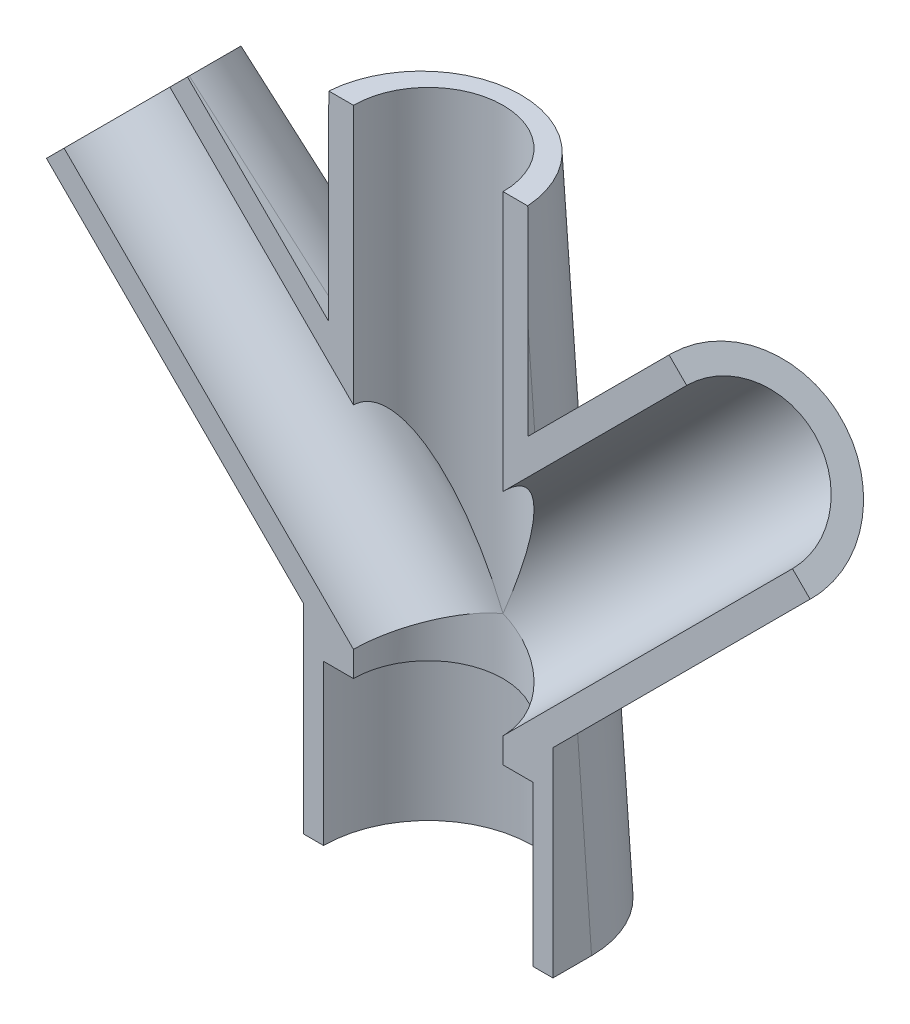
ISO-10303-21;
HEADER;
FILE_DESCRIPTION(('STEP AP214'),'2;1');
FILE_NAME('part.step','',(''),(''),'','','');
FILE_SCHEMA(('AUTOMOTIVE_DESIGN { 1 0 10303 214 1 1 1 1 }'));
ENDSEC;
DATA;
#1=APPLICATION_CONTEXT('core data for automotive mechanical design processes');
#2=APPLICATION_PROTOCOL_DEFINITION('international standard','automotive_design',2000,#1);
#3=PRODUCT_CONTEXT('',#1,'mechanical');
#4=PRODUCT('Part','Part','',(#3));
#5=PRODUCT_RELATED_PRODUCT_CATEGORY('part','',(#4));
#6=PRODUCT_DEFINITION_FORMATION('','',#4);
#7=PRODUCT_DEFINITION_CONTEXT('part definition',#1,'design');
#8=PRODUCT_DEFINITION('design','',#6,#7);
#9=PRODUCT_DEFINITION_SHAPE('','',#8);
#10=(LENGTH_UNIT() NAMED_UNIT(*) SI_UNIT(.MILLI.,.METRE.));
#11=(NAMED_UNIT(*) PLANE_ANGLE_UNIT() SI_UNIT($,.RADIAN.));
#12=(NAMED_UNIT(*) SI_UNIT($,.STERADIAN.) SOLID_ANGLE_UNIT());
#13=UNCERTAINTY_MEASURE_WITH_UNIT(LENGTH_MEASURE(1.E-05),#10,'distance_accuracy_value','');
#14=(GEOMETRIC_REPRESENTATION_CONTEXT(3) GLOBAL_UNCERTAINTY_ASSIGNED_CONTEXT((#13)) GLOBAL_UNIT_ASSIGNED_CONTEXT((#10,
#11,#12)) REPRESENTATION_CONTEXT('',''));
#15=CARTESIAN_POINT('',(0.,0.,0.));
#16=DIRECTION('',(0.,0.,1.));
#17=DIRECTION('',(1.,0.,0.));
#18=AXIS2_PLACEMENT_3D('',#15,#16,#17);
#19=CARTESIAN_POINT('',(0.,-10.,6.25));
#20=DIRECTION('',(0.,1.,0.));
#21=DIRECTION('',(0.,0.,1.));
#22=AXIS2_PLACEMENT_3D('',#19,#20,#21);
#23=CYLINDRICAL_SURFACE('',#22,3.75);
#24=CARTESIAN_POINT('',(0.,0.821067811865342,6.25));
#25=DIRECTION('',(-0.382683432365087,0.923879532511288,0.));
#26=DIRECTION('',(-0.923879532511288,-0.382683432365088,0.));
#27=AXIS2_PLACEMENT_3D('',#24,#25,#26);
#28=ELLIPSE('',#27,4.05897075109647,3.75);
#29=CARTESIAN_POINT('',(-3.75,-0.732233047033754,6.25));
#30=VERTEX_POINT('',#29);
#31=CARTESIAN_POINT('',(0.,0.821067811865341,2.5));
#32=VERTEX_POINT('',#31);
#33=EDGE_CURVE('E250',#30,#32,#28,.F.);
#34=ORIENTED_EDGE('',*,*,#33,.F.);
#35=DIRECTION('',(0.,1.,0.));
#36=VECTOR('',#35,1.);
#37=CARTESIAN_POINT('',(-3.75,-10.,6.25));
#38=LINE('',#37,#36);
#39=CARTESIAN_POINT('',(-3.75,-2.,6.25));
#40=VERTEX_POINT('',#39);
#41=EDGE_CURVE('E417',#30,#40,#38,.F.);
#42=ORIENTED_EDGE('',*,*,#41,.T.);
#43=CARTESIAN_POINT('',(0.,-2.,6.25));
#44=DIRECTION('',(0.,-1.,0.));
#45=DIRECTION('',(1.,0.,0.));
#46=AXIS2_PLACEMENT_3D('',#43,#44,#45);
#47=CIRCLE('',#46,3.75);
#48=CARTESIAN_POINT('',(3.75,-2.,6.25));
#49=VERTEX_POINT('',#48);
#50=EDGE_CURVE('E274',#49,#40,#47,.F.);
#51=ORIENTED_EDGE('',*,*,#50,.F.);
#52=DIRECTION('',(0.,1.,0.));
#53=VECTOR('',#52,1.);
#54=CARTESIAN_POINT('',(3.75,-10.,6.25));
#55=LINE('',#54,#53);
#56=CARTESIAN_POINT('',(3.75,-0.732233047033754,6.25));
#57=VERTEX_POINT('',#56);
#58=EDGE_CURVE('E430',#49,#57,#55,.T.);
#59=ORIENTED_EDGE('',*,*,#58,.T.);
#60=CARTESIAN_POINT('',(0.,0.821067811865342,6.25));
#61=DIRECTION('',(0.382683432365087,0.923879532511288,0.));
#62=DIRECTION('',(0.923879532511288,-0.382683432365088,0.));
#63=AXIS2_PLACEMENT_3D('',#60,#61,#62);
#64=ELLIPSE('',#63,4.05897075109647,3.75);
#65=EDGE_CURVE('E372',#57,#32,#64,.T.);
#66=ORIENTED_EDGE('',*,*,#65,.T.);
#67=EDGE_LOOP('',(#34,#42,#51,#59,#66));
#68=FACE_BOUND('',#67,.T.);
#69=ADVANCED_FACE('F37',(#68),#23,.F.);
#70=CARTESIAN_POINT('',(0.,22.892135623731,6.25));
#71=DIRECTION('',(0.,1.,0.));
#72=DIRECTION('',(0.,0.,1.));
#73=AXIS2_PLACEMENT_3D('',#70,#71,#72);
#74=CIRCLE('',#73,3.75);
#75=CARTESIAN_POINT('',(3.75,22.892135623731,6.25));
#76=VERTEX_POINT('',#75);
#77=CARTESIAN_POINT('',(-3.75,22.892135623731,6.25));
#78=VERTEX_POINT('',#77);
#79=EDGE_CURVE('E231',#76,#78,#74,.T.);
#80=ORIENTED_EDGE('',*,*,#79,.T.);
#81=DIRECTION('',(0.,1.,0.));
#82=VECTOR('',#81,1.);
#83=CARTESIAN_POINT('',(-3.75,-10.,6.25));
#84=LINE('',#83,#82);
#85=CARTESIAN_POINT('',(-3.75,9.87436867076451,6.25));
#86=VERTEX_POINT('',#85);
#87=EDGE_CURVE('E214',#78,#86,#84,.F.);
#88=ORIENTED_EDGE('',*,*,#87,.T.);
#89=CARTESIAN_POINT('',(0.,0.821067811865342,6.25));
#90=DIRECTION('',(-0.923879532511288,-0.382683432365088,0.));
#91=DIRECTION('',(-0.382683432365087,0.923879532511288,0.));
#92=AXIS2_PLACEMENT_3D('',#89,#90,#91);
#93=ELLIPSE('',#92,9.79922223657288,3.75);
#94=EDGE_CURVE('E375',#32,#86,#93,.F.);
#95=ORIENTED_EDGE('',*,*,#94,.F.);
#96=CARTESIAN_POINT('',(0.,0.821067811865342,6.25));
#97=DIRECTION('',(0.923879532511288,-0.382683432365088,0.));
#98=DIRECTION('',(0.382683432365087,0.923879532511288,0.));
#99=AXIS2_PLACEMENT_3D('',#96,#97,#98);
#100=ELLIPSE('',#99,9.79922223657288,3.75);
#101=CARTESIAN_POINT('',(3.75,9.87436867076451,6.25));
#102=VERTEX_POINT('',#101);
#103=EDGE_CURVE('E376',#32,#102,#100,.T.);
#104=ORIENTED_EDGE('',*,*,#103,.T.);
#105=DIRECTION('',(0.,1.,0.));
#106=VECTOR('',#105,1.);
#107=CARTESIAN_POINT('',(3.75,-10.,6.25));
#108=LINE('',#107,#106);
#109=EDGE_CURVE('E242',#102,#76,#108,.T.);
#110=ORIENTED_EDGE('',*,*,#109,.T.);
#111=EDGE_LOOP('',(#80,#88,#95,#104,#110));
#112=FACE_BOUND('',#111,.T.);
#113=ADVANCED_FACE('F240',(#112),#23,.F.);
#114=CARTESIAN_POINT('',(5.,12.892135623731,12.5));
#115=DIRECTION('',(-1.,0.,0.));
#116=DIRECTION('',(0.,-1.,0.));
#117=AXIS2_PLACEMENT_3D('',#114,#115,#116);
#118=PLANE('',#117);
#119=DIRECTION('',(0.,0.997564050259824,0.0697564737441255));
#120=VECTOR('',#119,1.);
#121=CARTESIAN_POINT('',(5.,22.5433532550103,6.5885943140451));
#122=LINE('',#121,#120);
#123=CARTESIAN_POINT('',(5.,12.892135623731,5.91371543371673));
#124=VERTEX_POINT('',#123);
#125=CARTESIAN_POINT('',(5.,17.7012289734311,6.25));
#126=VERTEX_POINT('',#125);
#127=EDGE_CURVE('E293',#124,#126,#122,.T.);
#128=ORIENTED_EDGE('',*,*,#127,.T.);
#129=DIRECTION('',(0.,-1.,0.));
#130=VECTOR('',#129,1.);
#131=CARTESIAN_POINT('',(5.,12.892135623731,6.25));
#132=LINE('',#131,#130);
#133=CARTESIAN_POINT('',(5.,12.892135623731,6.25));
#134=VERTEX_POINT('',#133);
#135=EDGE_CURVE('E236',#126,#134,#132,.T.);
#136=ORIENTED_EDGE('',*,*,#135,.T.);
#137=DIRECTION('',(0.,0.,-1.));
#138=VECTOR('',#137,1.);
#139=CARTESIAN_POINT('',(5.,12.892135623731,12.5));
#140=LINE('',#139,#138);
#141=EDGE_CURVE('E247',#134,#124,#140,.T.);
#142=ORIENTED_EDGE('',*,*,#141,.T.);
#143=EDGE_LOOP('',(#128,#136,#142));
#144=FACE_BOUND('',#143,.T.);
#145=ADVANCED_FACE('F518',(#144),#118,.F.);
#146=CARTESIAN_POINT('',(-5.00000000000003,22.892135623731,12.5));
#147=DIRECTION('',(0.,-1.,0.));
#148=DIRECTION('',(0.,0.,-1.));
#149=AXIS2_PLACEMENT_3D('',#146,#147,#148);
#150=PLANE('',#149);
#151=CARTESIAN_POINT('',(0.,22.892135623731,6.61298355315184));
#152=DIRECTION('',(0.,-1.,0.));
#153=DIRECTION('',(0.,0.,1.));
#154=AXIS2_PLACEMENT_3D('',#151,#152,#153);
#155=ELLIPSE('',#154,5.01220949040586,5.);
#156=CARTESIAN_POINT('',(0.,22.892135623731,1.60077406274597));
#157=VERTEX_POINT('',#156);
#158=CARTESIAN_POINT('',(-4.98687116992872,22.892135623731,6.25));
#159=VERTEX_POINT('',#158);
#160=EDGE_CURVE('E234',#157,#159,#155,.F.);
#161=ORIENTED_EDGE('',*,*,#160,.T.);
#162=DIRECTION('',(1.,0.,0.));
#163=VECTOR('',#162,1.);
#164=CARTESIAN_POINT('',(-24.7445923303939,22.892135623731,6.25));
#165=LINE('',#164,#163);
#166=EDGE_CURVE('E217',#159,#78,#165,.T.);
#167=ORIENTED_EDGE('',*,*,#166,.T.);
#168=ORIENTED_EDGE('',*,*,#79,.F.);
#169=CARTESIAN_POINT('',(4.98687116992869,22.892135623731,6.25));
#170=VERTEX_POINT('',#169);
#171=EDGE_CURVE('E237',#76,#170,#165,.T.);
#172=ORIENTED_EDGE('',*,*,#171,.T.);
#173=CARTESIAN_POINT('',(0.,22.892135623731,6.61298355315184));
#174=DIRECTION('',(0.,-1.,0.));
#175=DIRECTION('',(0.,0.,-1.));
#176=AXIS2_PLACEMENT_3D('',#173,#174,#175);
#177=ELLIPSE('',#176,5.01220949040586,5.);
#178=EDGE_CURVE('E297',#170,#157,#177,.F.);
#179=ORIENTED_EDGE('',*,*,#178,.T.);
#180=EDGE_LOOP('',(#161,#167,#168,#172,#179));
#181=FACE_BOUND('',#180,.T.);
#182=ADVANCED_FACE('F229',(#181),#150,.F.);
#183=CARTESIAN_POINT('',(-5.00000000000003,12.892135623731,12.5));
#184=DIRECTION('',(1.,0.,0.));
#185=DIRECTION('',(0.,1.,0.));
#186=AXIS2_PLACEMENT_3D('',#183,#184,#185);
#187=PLANE('',#186);
#188=DIRECTION('',(0.,0.,-1.));
#189=VECTOR('',#188,1.);
#190=CARTESIAN_POINT('',(-5.00000000000003,12.892135623731,12.5));
#191=LINE('',#190,#189);
#192=CARTESIAN_POINT('',(-5.00000000000003,12.892135623731,6.25));
#193=VERTEX_POINT('',#192);
#194=CARTESIAN_POINT('',(-5.00000000000003,12.892135623731,5.91371543371673));
#195=VERTEX_POINT('',#194);
#196=EDGE_CURVE('E271',#193,#195,#191,.T.);
#197=ORIENTED_EDGE('',*,*,#196,.F.);
#198=DIRECTION('',(0.,1.,0.));
#199=VECTOR('',#198,1.);
#200=CARTESIAN_POINT('',(-5.00000000000003,12.892135623731,6.25));
#201=LINE('',#200,#199);
#202=CARTESIAN_POINT('',(-5.00000000000003,17.7012289734311,6.25));
#203=VERTEX_POINT('',#202);
#204=EDGE_CURVE('E397',#193,#203,#201,.T.);
#205=ORIENTED_EDGE('',*,*,#204,.T.);
#206=DIRECTION('',(0.,-0.997564050259824,-0.0697564737441255));
#207=VECTOR('',#206,1.);
#208=CARTESIAN_POINT('',(-5.00000000000003,12.5433532550103,5.88932619460999));
#209=LINE('',#208,#207);
#210=EDGE_CURVE('E299',#203,#195,#209,.T.);
#211=ORIENTED_EDGE('',*,*,#210,.T.);
#212=EDGE_LOOP('',(#197,#205,#211));
#213=FACE_BOUND('',#212,.T.);
#214=ADVANCED_FACE('F489',(#213),#187,.F.);
#215=CARTESIAN_POINT('',(-12.0710678118655,19.9632034355965,12.5));
#216=DIRECTION('',(-0.707106781186551,-0.707106781186544,0.));
#217=DIRECTION('',(0.707106781186544,-0.707106781186551,0.));
#218=AXIS2_PLACEMENT_3D('',#215,#216,#217);
#219=PLANE('',#218);
#220=DIRECTION('',(0.,0.,-1.));
#221=VECTOR('',#220,1.);
#222=CARTESIAN_POINT('',(-12.0710678118655,19.9632034355965,12.5));
#223=LINE('',#222,#221);
#224=CARTESIAN_POINT('',(-12.0710678118655,19.9632034355965,6.25));
#225=VERTEX_POINT('',#224);
#226=CARTESIAN_POINT('',(-12.0710678118655,19.9632034355965,6.1609440482768));
#227=VERTEX_POINT('',#226);
#228=EDGE_CURVE('E269',#225,#227,#223,.T.);
#229=ORIENTED_EDGE('',*,*,#228,.F.);
#230=DIRECTION('',(0.707106781186544,-0.707106781186551,0.));
#231=VECTOR('',#230,1.);
#232=CARTESIAN_POINT('',(-12.0710678118655,19.9632034355965,6.25));
#233=LINE('',#232,#231);
#234=EDGE_CURVE('E406',#225,#193,#233,.T.);
#235=ORIENTED_EDGE('',*,*,#234,.T.);
#236=ORIENTED_EDGE('',*,*,#196,.T.);
#237=CARTESIAN_POINT('',(0.,7.8921356237309,5.56408137399917));
#238=DIRECTION('',(-0.707106781186551,-0.707106781186544,0.));
#239=DIRECTION('',(-0.703674354609934,0.703674354609941,0.0984114085285601));
#240=AXIS2_PLACEMENT_3D('',#237,#238,#239);
#241=ELLIPSE('',#240,7.08833463878715,5.);
#242=CARTESIAN_POINT('',(-4.99391383882773,12.8860494625587,5.66606123330891));
#243=VERTEX_POINT('',#242);
#244=EDGE_CURVE('E329',#195,#243,#241,.T.);
#245=ORIENTED_EDGE('',*,*,#244,.T.);
#246=DIRECTION('',(-0.706243967529306,0.706243967529313,0.049385389103661));
#247=VECTOR('',#246,1.);
#248=CARTESIAN_POINT('',(-11.9048741744751,19.7970097982061,6.14932265704879));
#249=LINE('',#248,#247);
#250=EDGE_CURVE('E302',#243,#227,#249,.T.);
#251=ORIENTED_EDGE('',*,*,#250,.T.);
#252=EDGE_LOOP('',(#229,#235,#236,#245,#251));
#253=FACE_BOUND('',#252,.T.);
#254=ADVANCED_FACE('F492',(#253),#219,.F.);
#255=CARTESIAN_POINT('',(-19.142135623731,12.892135623731,12.5));
#256=DIRECTION('',(0.707106781186544,-0.707106781186551,0.));
#257=DIRECTION('',(0.707106781186551,0.707106781186544,0.));
#258=AXIS2_PLACEMENT_3D('',#255,#256,#257);
#259=PLANE('',#258);
#260=DIRECTION('',(0.,0.,-1.));
#261=VECTOR('',#260,1.);
#262=CARTESIAN_POINT('',(-19.142135623731,12.892135623731,12.5));
#263=LINE('',#262,#261);
#264=CARTESIAN_POINT('',(-19.142135623731,12.892135623731,6.25));
#265=VERTEX_POINT('',#264);
#266=CARTESIAN_POINT('',(-19.142135623731,12.892135623731,6.16094404827679));
#267=VERTEX_POINT('',#266);
#268=EDGE_CURVE('E267',#265,#267,#263,.T.);
#269=ORIENTED_EDGE('',*,*,#268,.F.);
#270=DIRECTION('',(0.707106781186551,0.707106781186544,0.));
#271=VECTOR('',#270,1.);
#272=CARTESIAN_POINT('',(-19.142135623731,12.892135623731,6.25));
#273=LINE('',#272,#271);
#274=CARTESIAN_POINT('',(-18.2582521472478,13.7760191002142,6.25));
#275=VERTEX_POINT('',#274);
#276=EDGE_CURVE('E412',#265,#275,#273,.T.);
#277=ORIENTED_EDGE('',*,*,#276,.T.);
#278=CARTESIAN_POINT('',(-15.6066017177982,16.4276695296637,6.25));
#279=DIRECTION('',(-0.707106781186544,0.707106781186551,0.));
#280=DIRECTION('',(-0.707106781186551,-0.707106781186544,0.));
#281=AXIS2_PLACEMENT_3D('',#278,#279,#280);
#282=CIRCLE('',#281,3.75);
#283=CARTESIAN_POINT('',(-12.9549512883487,19.0793199591133,6.25));
#284=VERTEX_POINT('',#283);
#285=EDGE_CURVE('E244',#284,#275,#282,.T.);
#286=ORIENTED_EDGE('',*,*,#285,.F.);
#287=EDGE_CURVE('E409',#284,#225,#273,.T.);
#288=ORIENTED_EDGE('',*,*,#287,.T.);
#289=ORIENTED_EDGE('',*,*,#228,.T.);
#290=CARTESIAN_POINT('',(-15.6066017177982,16.4276695296637,6.1609440482768));
#291=DIRECTION('',(0.707106781186544,-0.707106781186551,0.));
#292=DIRECTION('',(0.,0.,-1.));
#293=AXIS2_PLACEMENT_3D('',#290,#291,#292);
#294=ELLIPSE('',#293,5.00610846744827,5.);
#295=CARTESIAN_POINT('',(-15.4322105334379,16.602060714024,1.1609291774243));
#296=VERTEX_POINT('',#295);
#297=EDGE_CURVE('E308',#227,#296,#294,.F.);
#298=ORIENTED_EDGE('',*,*,#297,.T.);
#299=CARTESIAN_POINT('',(-15.6066017177982,16.4276695296637,6.16094404827679));
#300=DIRECTION('',(0.707106781186544,-0.707106781186551,0.));
#301=DIRECTION('',(0.,0.,1.));
#302=AXIS2_PLACEMENT_3D('',#299,#300,#301);
#303=ELLIPSE('',#302,5.00610846744827,5.);
#304=EDGE_CURVE('E305',#296,#267,#303,.F.);
#305=ORIENTED_EDGE('',*,*,#304,.T.);
#306=EDGE_LOOP('',(#269,#277,#286,#288,#289,#298,#305));
#307=FACE_BOUND('',#306,.T.);
#308=ADVANCED_FACE('F495',(#307),#259,.F.);
#309=CARTESIAN_POINT('',(-6.24999999999999,0.,12.5));
#310=DIRECTION('',(0.707106781186548,0.707106781186548,0.));
#311=DIRECTION('',(-0.707106781186548,0.707106781186548,0.));
#312=AXIS2_PLACEMENT_3D('',#309,#310,#311);
#313=PLANE('',#312);
#314=DIRECTION('',(0.,0.,-1.));
#315=VECTOR('',#314,1.);
#316=CARTESIAN_POINT('',(-6.24999999999999,0.,12.5));
#317=LINE('',#316,#315);
#318=CARTESIAN_POINT('',(-6.24999999999999,0.,6.25));
#319=VERTEX_POINT('',#318);
#320=CARTESIAN_POINT('',(-6.24999999999999,0.,5.25943810496592));
#321=VERTEX_POINT('',#320);
#322=EDGE_CURVE('E265',#319,#321,#317,.T.);
#323=ORIENTED_EDGE('',*,*,#322,.F.);
#324=DIRECTION('',(-0.707106781186548,0.707106781186548,0.));
#325=VECTOR('',#324,1.);
#326=CARTESIAN_POINT('',(-6.24999999999999,0.,6.25));
#327=LINE('',#326,#325);
#328=EDGE_CURVE('E422',#319,#265,#327,.T.);
#329=ORIENTED_EDGE('',*,*,#328,.T.);
#330=ORIENTED_EDGE('',*,*,#268,.T.);
#331=DIRECTION('',(0.706243967529309,-0.706243967529309,-0.0493853891036608));
#332=VECTOR('',#331,1.);
#333=CARTESIAN_POINT('',(-6.06656061754104,-0.183439382458955,5.24661077376568));
#334=LINE('',#333,#332);
#335=EDGE_CURVE('E310',#267,#321,#334,.T.);
#336=ORIENTED_EDGE('',*,*,#335,.T.);
#337=EDGE_LOOP('',(#323,#329,#330,#336));
#338=FACE_BOUND('',#337,.T.);
#339=ADVANCED_FACE('F546',(#338),#313,.F.);
#340=CARTESIAN_POINT('',(-6.24999999999999,0.,12.5));
#341=DIRECTION('',(1.,0.,0.));
#342=DIRECTION('',(0.,1.,0.));
#343=AXIS2_PLACEMENT_3D('',#340,#341,#342);
#344=PLANE('',#343);
#345=DIRECTION('',(0.,0.,-1.));
#346=VECTOR('',#345,1.);
#347=CARTESIAN_POINT('',(-6.24999999999999,-10.,12.5));
#348=LINE('',#347,#346);
#349=CARTESIAN_POINT('',(-6.24999999999999,-10.,6.25));
#350=VERTEX_POINT('',#349);
#351=CARTESIAN_POINT('',(-6.24999999999999,-10.,4.31294137097075));
#352=VERTEX_POINT('',#351);
#353=EDGE_CURVE('E263',#350,#352,#348,.T.);
#354=ORIENTED_EDGE('',*,*,#353,.F.);
#355=DIRECTION('',(0.,1.,0.));
#356=VECTOR('',#355,1.);
#357=CARTESIAN_POINT('',(-6.24999999999999,0.,6.25));
#358=LINE('',#357,#356);
#359=EDGE_CURVE('E425',#350,#319,#358,.T.);
#360=ORIENTED_EDGE('',*,*,#359,.T.);
#361=ORIENTED_EDGE('',*,*,#322,.T.);
#362=CARTESIAN_POINT('',(-6.25,7.07106781186548,5.50666671952599));
#363=DIRECTION('',(1.,0.,0.));
#364=DIRECTION('',(0.,0.997564050259824,0.0697564737441254));
#365=AXIS2_PLACEMENT_3D('',#362,#363,#364);
#366=ELLIPSE('',#365,7.07970648937614,5.);
#367=CARTESIAN_POINT('',(-6.24999999999999,0.008607131672656,5.01281135968371));
#368=VERTEX_POINT('',#367);
#369=EDGE_CURVE('E46',#321,#368,#366,.T.);
#370=ORIENTED_EDGE('',*,*,#369,.T.);
#371=DIRECTION('',(0.,-0.997564050259824,-0.0697564737441254));
#372=VECTOR('',#371,1.);
#373=CARTESIAN_POINT('',(-6.24999999999999,-10.3487823687206,4.28855213186402));
#374=LINE('',#373,#372);
#375=EDGE_CURVE('E313',#368,#352,#374,.T.);
#376=ORIENTED_EDGE('',*,*,#375,.T.);
#377=EDGE_LOOP('',(#354,#360,#361,#370,#376));
#378=FACE_BOUND('',#377,.T.);
#379=ADVANCED_FACE('F506',(#378),#344,.F.);
#380=CARTESIAN_POINT('',(-6.24999999999999,-10.,12.5));
#381=DIRECTION('',(0.,1.,0.));
#382=DIRECTION('',(-1.,0.,0.));
#383=AXIS2_PLACEMENT_3D('',#380,#381,#382);
#384=PLANE('',#383);
#385=DIRECTION('',(0.,0.,-1.));
#386=VECTOR('',#385,1.);
#387=CARTESIAN_POINT('',(6.25,-10.,12.5));
#388=LINE('',#387,#386);
#389=CARTESIAN_POINT('',(6.25,-10.,6.25));
#390=VERTEX_POINT('',#389);
#391=CARTESIAN_POINT('',(6.25,-10.,4.31294137097076));
#392=VERTEX_POINT('',#391);
#393=EDGE_CURVE('E261',#390,#392,#388,.T.);
#394=ORIENTED_EDGE('',*,*,#393,.F.);
#395=DIRECTION('',(1.,0.,0.));
#396=VECTOR('',#395,1.);
#397=CARTESIAN_POINT('',(-24.7445923303939,-10.,6.25));
#398=LINE('',#397,#396);
#399=CARTESIAN_POINT('',(5.25,-10.,6.25));
#400=VERTEX_POINT('',#399);
#401=EDGE_CURVE('E445',#400,#390,#398,.T.);
#402=ORIENTED_EDGE('',*,*,#401,.F.);
#403=CARTESIAN_POINT('',(0.,-10.,6.25));
#404=DIRECTION('',(0.,-1.,0.));
#405=DIRECTION('',(1.,0.,0.));
#406=AXIS2_PLACEMENT_3D('',#403,#404,#405);
#407=CIRCLE('',#406,5.25);
#408=CARTESIAN_POINT('',(-5.25,-10.,6.25));
#409=VERTEX_POINT('',#408);
#410=EDGE_CURVE('E360',#409,#400,#407,.T.);
#411=ORIENTED_EDGE('',*,*,#410,.F.);
#412=EDGE_CURVE('E54',#350,#409,#398,.T.);
#413=ORIENTED_EDGE('',*,*,#412,.F.);
#414=ORIENTED_EDGE('',*,*,#353,.T.);
#415=CARTESIAN_POINT('',(-1.24999999999999,-10.,4.31294137097076));
#416=DIRECTION('',(0.,1.,0.));
#417=DIRECTION('',(0.,0.,1.));
#418=AXIS2_PLACEMENT_3D('',#415,#416,#417);
#419=ELLIPSE('',#418,5.01220949040586,5.);
#420=CARTESIAN_POINT('',(-1.24999999999999,-10.,-0.699268119435106));
#421=VERTEX_POINT('',#420);
#422=EDGE_CURVE('E319',#352,#421,#419,.F.);
#423=ORIENTED_EDGE('',*,*,#422,.T.);
#424=DIRECTION('',(1.,0.,0.));
#425=VECTOR('',#424,1.);
#426=CARTESIAN_POINT('',(0.,-10.,-0.699268119435106));
#427=LINE('',#426,#425);
#428=CARTESIAN_POINT('',(1.25,-10.,-0.699268119435106));
#429=VERTEX_POINT('',#428);
#430=EDGE_CURVE('E243',#421,#429,#427,.T.);
#431=ORIENTED_EDGE('',*,*,#430,.T.);
#432=CARTESIAN_POINT('',(1.25,-10.,4.31294137097076));
#433=DIRECTION('',(0.,1.,0.));
#434=DIRECTION('',(0.,0.,-1.));
#435=AXIS2_PLACEMENT_3D('',#432,#433,#434);
#436=ELLIPSE('',#435,5.01220949040586,5.);
#437=EDGE_CURVE('E316',#429,#392,#436,.F.);
#438=ORIENTED_EDGE('',*,*,#437,.T.);
#439=EDGE_LOOP('',(#394,#402,#411,#413,#414,#423,#431,#438));
#440=FACE_BOUND('',#439,.T.);
#441=ADVANCED_FACE('F444',(#440),#384,.F.);
#442=CARTESIAN_POINT('',(6.24999999999999,0.,12.5));
#443=DIRECTION('',(-1.,0.,0.));
#444=DIRECTION('',(0.,-1.,0.));
#445=AXIS2_PLACEMENT_3D('',#442,#443,#444);
#446=PLANE('',#445);
#447=DIRECTION('',(0.,0.,-1.));
#448=VECTOR('',#447,1.);
#449=CARTESIAN_POINT('',(6.24999999999999,0.,12.5));
#450=LINE('',#449,#448);
#451=CARTESIAN_POINT('',(6.24999999999999,0.,6.25));
#452=VERTEX_POINT('',#451);
#453=CARTESIAN_POINT('',(6.24999999999999,0.,5.25943810496593));
#454=VERTEX_POINT('',#453);
#455=EDGE_CURVE('E259',#452,#454,#450,.T.);
#456=ORIENTED_EDGE('',*,*,#455,.F.);
#457=DIRECTION('',(0.,-1.,0.));
#458=VECTOR('',#457,1.);
#459=CARTESIAN_POINT('',(6.24999999999999,0.,6.25));
#460=LINE('',#459,#458);
#461=EDGE_CURVE('E338',#452,#390,#460,.T.);
#462=ORIENTED_EDGE('',*,*,#461,.T.);
#463=ORIENTED_EDGE('',*,*,#393,.T.);
#464=DIRECTION('',(0.,0.997564050259824,0.0697564737441254));
#465=VECTOR('',#464,1.);
#466=CARTESIAN_POINT('',(6.24999999999999,-0.348782368720626,4.98782025129912));
#467=LINE('',#466,#465);
#468=CARTESIAN_POINT('',(6.24999999999999,0.00860713167265768,5.01281135968371));
#469=VERTEX_POINT('',#468);
#470=EDGE_CURVE('E321',#392,#469,#467,.T.);
#471=ORIENTED_EDGE('',*,*,#470,.T.);
#472=CARTESIAN_POINT('',(6.24999999999999,7.07106781186547,5.50666671952599));
#473=DIRECTION('',(-1.,0.,0.));
#474=DIRECTION('',(0.,-0.997564050259824,-0.0697564737441255));
#475=AXIS2_PLACEMENT_3D('',#472,#473,#474);
#476=ELLIPSE('',#475,7.07970648937613,5.);
#477=EDGE_CURVE('E11',#469,#454,#476,.T.);
#478=ORIENTED_EDGE('',*,*,#477,.T.);
#479=EDGE_LOOP('',(#456,#462,#463,#471,#478));
#480=FACE_BOUND('',#479,.T.);
#481=ADVANCED_FACE('F441',(#480),#446,.F.);
#482=CARTESIAN_POINT('',(6.24999999999999,0.,12.5));
#483=DIRECTION('',(-0.707106781186547,0.707106781186548,0.));
#484=DIRECTION('',(-0.707106781186548,-0.707106781186547,0.));
#485=AXIS2_PLACEMENT_3D('',#482,#483,#484);
#486=PLANE('',#485);
#487=DIRECTION('',(0.,0.,-1.));
#488=VECTOR('',#487,1.);
#489=CARTESIAN_POINT('',(19.142135623731,12.892135623731,12.5));
#490=LINE('',#489,#488);
#491=CARTESIAN_POINT('',(19.142135623731,12.892135623731,6.25));
#492=VERTEX_POINT('',#491);
#493=CARTESIAN_POINT('',(19.142135623731,12.892135623731,6.1609440482768));
#494=VERTEX_POINT('',#493);
#495=EDGE_CURVE('E257',#492,#494,#490,.T.);
#496=ORIENTED_EDGE('',*,*,#495,.F.);
#497=DIRECTION('',(-0.707106781186548,-0.707106781186547,0.));
#498=VECTOR('',#497,1.);
#499=CARTESIAN_POINT('',(6.24999999999999,0.,6.25));
#500=LINE('',#499,#498);
#501=EDGE_CURVE('E435',#492,#452,#500,.T.);
#502=ORIENTED_EDGE('',*,*,#501,.T.);
#503=ORIENTED_EDGE('',*,*,#455,.T.);
#504=DIRECTION('',(0.706243967529309,0.706243967529309,0.0493853891036608));
#505=VECTOR('',#504,1.);
#506=CARTESIAN_POINT('',(18.958696241272,12.708696241272,6.14811671707655));
#507=LINE('',#506,#505);
#508=EDGE_CURVE('E323',#454,#494,#507,.T.);
#509=ORIENTED_EDGE('',*,*,#508,.T.);
#510=EDGE_LOOP('',(#496,#502,#503,#509));
#511=FACE_BOUND('',#510,.T.);
#512=ADVANCED_FACE('F461',(#511),#486,.F.);
#513=CARTESIAN_POINT('',(19.142135623731,12.892135623731,12.5));
#514=DIRECTION('',(-0.707106781186544,-0.707106781186551,0.));
#515=DIRECTION('',(0.707106781186551,-0.707106781186544,0.));
#516=AXIS2_PLACEMENT_3D('',#513,#514,#515);
#517=PLANE('',#516);
#518=DIRECTION('',(0.,0.,-1.));
#519=VECTOR('',#518,1.);
#520=CARTESIAN_POINT('',(12.0710678118655,19.9632034355965,12.5));
#521=LINE('',#520,#519);
#522=CARTESIAN_POINT('',(12.0710678118655,19.9632034355965,6.25));
#523=VERTEX_POINT('',#522);
#524=CARTESIAN_POINT('',(12.0710678118655,19.9632034355965,6.1609440482768));
#525=VERTEX_POINT('',#524);
#526=EDGE_CURVE('E255',#523,#525,#521,.T.);
#527=ORIENTED_EDGE('',*,*,#526,.F.);
#528=DIRECTION('',(0.707106781186551,-0.707106781186544,0.));
#529=VECTOR('',#528,1.);
#530=CARTESIAN_POINT('',(19.142135623731,12.892135623731,6.25));
#531=LINE('',#530,#529);
#532=CARTESIAN_POINT('',(12.9549512883487,19.0793199591133,6.25));
#533=VERTEX_POINT('',#532);
#534=EDGE_CURVE('E395',#523,#533,#531,.T.);
#535=ORIENTED_EDGE('',*,*,#534,.T.);
#536=CARTESIAN_POINT('',(15.6066017177982,16.4276695296637,6.25));
#537=DIRECTION('',(-0.707106781186544,-0.707106781186551,0.));
#538=DIRECTION('',(0.707106781186551,-0.707106781186544,0.));
#539=AXIS2_PLACEMENT_3D('',#536,#537,#538);
#540=CIRCLE('',#539,3.75);
#541=CARTESIAN_POINT('',(18.2582521472478,13.7760191002142,6.25));
#542=VERTEX_POINT('',#541);
#543=EDGE_CURVE('E276',#533,#542,#540,.T.);
#544=ORIENTED_EDGE('',*,*,#543,.T.);
#545=EDGE_CURVE('E401',#542,#492,#531,.T.);
#546=ORIENTED_EDGE('',*,*,#545,.T.);
#547=ORIENTED_EDGE('',*,*,#495,.T.);
#548=CARTESIAN_POINT('',(15.6066017177982,16.4276695296637,6.16094404827679));
#549=DIRECTION('',(-0.707106781186544,-0.707106781186551,0.));
#550=DIRECTION('',(0.,0.,-1.));
#551=AXIS2_PLACEMENT_3D('',#548,#549,#550);
#552=ELLIPSE('',#551,5.00610846744827,5.);
#553=CARTESIAN_POINT('',(15.4322105334379,16.602060714024,1.1609291774243));
#554=VERTEX_POINT('',#553);
#555=EDGE_CURVE('E288',#494,#554,#552,.F.);
#556=ORIENTED_EDGE('',*,*,#555,.T.);
#557=CARTESIAN_POINT('',(15.6066017177982,16.4276695296637,6.1609440482768));
#558=DIRECTION('',(-0.707106781186544,-0.707106781186551,0.));
#559=DIRECTION('',(0.,0.,1.));
#560=AXIS2_PLACEMENT_3D('',#557,#558,#559);
#561=ELLIPSE('',#560,5.00610846744827,5.);
#562=EDGE_CURVE('E290',#554,#525,#561,.F.);
#563=ORIENTED_EDGE('',*,*,#562,.T.);
#564=EDGE_LOOP('',(#527,#535,#544,#546,#547,#556,#563));
#565=FACE_BOUND('',#564,.T.);
#566=ADVANCED_FACE('F466',(#565),#517,.F.);
#567=CARTESIAN_POINT('',(12.0710678118655,19.9632034355965,12.5));
#568=DIRECTION('',(0.70710678118655,-0.707106781186545,0.));
#569=DIRECTION('',(0.707106781186545,0.70710678118655,0.));
#570=AXIS2_PLACEMENT_3D('',#567,#568,#569);
#571=PLANE('',#570);
#572=ORIENTED_EDGE('',*,*,#141,.F.);
#573=DIRECTION('',(0.707106781186545,0.70710678118655,0.));
#574=VECTOR('',#573,1.);
#575=CARTESIAN_POINT('',(12.0710678118655,19.9632034355965,6.25));
#576=LINE('',#575,#574);
#577=EDGE_CURVE('E399',#134,#523,#576,.T.);
#578=ORIENTED_EDGE('',*,*,#577,.T.);
#579=ORIENTED_EDGE('',*,*,#526,.T.);
#580=DIRECTION('',(-0.706243967529307,-0.706243967529312,-0.049385389103661));
#581=VECTOR('',#580,1.);
#582=CARTESIAN_POINT('',(4.83380636260961,12.7259419863406,5.65486542792866));
#583=LINE('',#582,#581);
#584=CARTESIAN_POINT('',(4.9939138388277,12.8860494625587,5.66606123330891));
#585=VERTEX_POINT('',#584);
#586=EDGE_CURVE('E273',#525,#585,#583,.T.);
#587=ORIENTED_EDGE('',*,*,#586,.T.);
#588=CARTESIAN_POINT('',(0.,7.89213562373092,5.56408137399917));
#589=DIRECTION('',(0.70710678118655,-0.707106781186545,0.));
#590=DIRECTION('',(-0.703674354609935,-0.70367435460994,-0.0984114085285603));
#591=AXIS2_PLACEMENT_3D('',#588,#589,#590);
#592=ELLIPSE('',#591,7.08833463878713,5.);
#593=EDGE_CURVE('E326',#585,#124,#592,.T.);
#594=ORIENTED_EDGE('',*,*,#593,.T.);
#595=EDGE_LOOP('',(#572,#578,#579,#587,#594));
#596=FACE_BOUND('',#595,.T.);
#597=ADVANCED_FACE('F472',(#596),#571,.F.);
#598=CARTESIAN_POINT('',(0.,0.,0.));
#599=DIRECTION('',(0.,0.0697564737441255,-0.997564050259824));
#600=DIRECTION('',(0.,0.997564050259824,0.0697564737441255));
#601=AXIS2_PLACEMENT_3D('',#598,#599,#600);
#602=PLANE('',#601);
#603=ORIENTED_EDGE('',*,*,#430,.F.);
#604=DIRECTION('',(0.,-0.997564050259824,-0.0697564737441255));
#605=VECTOR('',#604,1.);
#606=CARTESIAN_POINT('',(-1.24999999999999,0.,0.));
#607=LINE('',#606,#605);
#608=CARTESIAN_POINT('',(-1.25000000000005,2.41985018058605,0.169212408509311));
#609=VERTEX_POINT('',#608);
#610=EDGE_CURVE('E286',#421,#609,#607,.F.);
#611=ORIENTED_EDGE('',*,*,#610,.T.);
#612=DIRECTION('',(-0.706243967529306,0.706243967529313,0.049385389103661));
#613=VECTOR('',#612,1.);
#614=CARTESIAN_POINT('',(-8.3693402685424,9.53919044912847,0.667045176629539));
#615=LINE('',#614,#613);
#616=CARTESIAN_POINT('',(0.,1.16985018058605,0.0818038935799226));
#617=VERTEX_POINT('',#616);
#618=EDGE_CURVE('E284',#609,#617,#615,.F.);
#619=ORIENTED_EDGE('',*,*,#618,.T.);
#620=DIRECTION('',(-0.706243967529307,-0.706243967529312,-0.0493853891036609));
#621=VECTOR('',#620,1.);
#622=CARTESIAN_POINT('',(15.4404080804078,16.610258260994,1.16150240574967));
#623=LINE('',#622,#621);
#624=CARTESIAN_POINT('',(1.24999999999999,2.41985018058611,0.169212408509315));
#625=VERTEX_POINT('',#624);
#626=EDGE_CURVE('E282',#617,#625,#623,.F.);
#627=ORIENTED_EDGE('',*,*,#626,.T.);
#628=DIRECTION('',(0.,0.997564050259824,0.0697564737441255));
#629=VECTOR('',#628,1.);
#630=CARTESIAN_POINT('',(1.25,-10.,-0.699268119435106));
#631=LINE('',#630,#629);
#632=EDGE_CURVE('E280',#625,#429,#631,.F.);
#633=ORIENTED_EDGE('',*,*,#632,.T.);
#634=EDGE_LOOP('',(#603,#611,#619,#627,#633));
#635=FACE_BOUND('',#634,.T.);
#636=ADVANCED_FACE('F512',(#635),#602,.T.);
#637=CARTESIAN_POINT('',(14.9826017177981,-14.1615339059329,6.25));
#638=DIRECTION('',(-0.707106781186544,0.707106781186551,0.));
#639=DIRECTION('',(-0.707106781186551,-0.707106781186544,0.));
#640=AXIS2_PLACEMENT_3D('',#637,#638,#639);
#641=CYLINDRICAL_SURFACE('',#640,3.75);
#642=ORIENTED_EDGE('',*,*,#285,.T.);
#643=DIRECTION('',(-0.707106781186544,0.707106781186551,0.));
#644=VECTOR('',#643,1.);
#645=CARTESIAN_POINT('',(12.3309512883485,-16.8131843353824,6.25));
#646=LINE('',#645,#644);
#647=EDGE_CURVE('E420',#275,#30,#646,.F.);
#648=ORIENTED_EDGE('',*,*,#647,.T.);
#649=ORIENTED_EDGE('',*,*,#33,.T.);
#650=ORIENTED_EDGE('',*,*,#94,.T.);
#651=DIRECTION('',(-0.707106781186544,0.707106781186551,0.));
#652=VECTOR('',#651,1.);
#653=CARTESIAN_POINT('',(17.6342521472476,-11.5098834764833,6.25));
#654=LINE('',#653,#652);
#655=EDGE_CURVE('E220',#86,#284,#654,.T.);
#656=ORIENTED_EDGE('',*,*,#655,.T.);
#657=EDGE_LOOP('',(#642,#648,#649,#650,#656));
#658=FACE_BOUND('',#657,.T.);
#659=ADVANCED_FACE('F381',(#658),#641,.F.);
#660=CARTESIAN_POINT('',(-14.9826017177981,-14.1615339059329,6.25));
#661=DIRECTION('',(0.707106781186544,0.707106781186551,0.));
#662=DIRECTION('',(-0.707106781186551,0.707106781186544,0.));
#663=AXIS2_PLACEMENT_3D('',#660,#661,#662);
#664=CYLINDRICAL_SURFACE('',#663,3.75);
#665=DIRECTION('',(0.707106781186544,0.707106781186551,0.));
#666=VECTOR('',#665,1.);
#667=CARTESIAN_POINT('',(-17.6342521472476,-11.5098834764833,6.25));
#668=LINE('',#667,#666);
#669=EDGE_CURVE('E392',#102,#533,#668,.T.);
#670=ORIENTED_EDGE('',*,*,#669,.F.);
#671=ORIENTED_EDGE('',*,*,#103,.F.);
#672=ORIENTED_EDGE('',*,*,#65,.F.);
#673=DIRECTION('',(0.707106781186544,0.707106781186551,0.));
#674=VECTOR('',#673,1.);
#675=CARTESIAN_POINT('',(-12.3309512883485,-16.8131843353824,6.25));
#676=LINE('',#675,#674);
#677=EDGE_CURVE('E433',#542,#57,#676,.F.);
#678=ORIENTED_EDGE('',*,*,#677,.F.);
#679=ORIENTED_EDGE('',*,*,#543,.F.);
#680=EDGE_LOOP('',(#670,#671,#672,#678,#679));
#681=FACE_BOUND('',#680,.T.);
#682=ADVANCED_FACE('F389',(#681),#664,.F.);
#683=CARTESIAN_POINT('',(0.,-2.,6.25));
#684=DIRECTION('',(0.,-1.,0.));
#685=DIRECTION('',(1.,0.,0.));
#686=AXIS2_PLACEMENT_3D('',#683,#684,#685);
#687=PLANE('',#686);
#688=DIRECTION('',(1.,0.,0.));
#689=VECTOR('',#688,1.);
#690=CARTESIAN_POINT('',(0.,-2.,6.25));
#691=LINE('',#690,#689);
#692=CARTESIAN_POINT('',(-5.25,-2.,6.25));
#693=VERTEX_POINT('',#692);
#694=EDGE_CURVE('E415',#693,#40,#691,.T.);
#695=ORIENTED_EDGE('',*,*,#694,.F.);
#696=CARTESIAN_POINT('',(0.,-2.,6.25));
#697=DIRECTION('',(0.,-1.,0.));
#698=DIRECTION('',(1.,0.,0.));
#699=AXIS2_PLACEMENT_3D('',#696,#697,#698);
#700=CIRCLE('',#699,5.25);
#701=CARTESIAN_POINT('',(5.25,-2.,6.25));
#702=VERTEX_POINT('',#701);
#703=EDGE_CURVE('E277',#693,#702,#700,.T.);
#704=ORIENTED_EDGE('',*,*,#703,.T.);
#705=EDGE_CURVE('E62',#49,#702,#691,.T.);
#706=ORIENTED_EDGE('',*,*,#705,.F.);
#707=ORIENTED_EDGE('',*,*,#50,.T.);
#708=EDGE_LOOP('',(#695,#704,#706,#707));
#709=FACE_BOUND('',#708,.T.);
#710=ADVANCED_FACE('F501',(#709),#687,.T.);
#711=CARTESIAN_POINT('',(0.,-2.,6.25));
#712=DIRECTION('',(0.,-1.,0.));
#713=DIRECTION('',(1.,0.,0.));
#714=AXIS2_PLACEMENT_3D('',#711,#712,#713);
#715=CYLINDRICAL_SURFACE('',#714,5.25);
#716=ORIENTED_EDGE('',*,*,#410,.T.);
#717=DIRECTION('',(0.,-1.,0.));
#718=VECTOR('',#717,1.);
#719=CARTESIAN_POINT('',(5.25,-2.,6.25));
#720=LINE('',#719,#718);
#721=EDGE_CURVE('E428',#400,#702,#720,.F.);
#722=ORIENTED_EDGE('',*,*,#721,.T.);
#723=ORIENTED_EDGE('',*,*,#703,.F.);
#724=DIRECTION('',(0.,-1.,0.));
#725=VECTOR('',#724,1.);
#726=CARTESIAN_POINT('',(-5.25,-2.,6.25));
#727=LINE('',#726,#725);
#728=EDGE_CURVE('E225',#693,#409,#727,.T.);
#729=ORIENTED_EDGE('',*,*,#728,.T.);
#730=EDGE_LOOP('',(#716,#722,#723,#729));
#731=FACE_BOUND('',#730,.T.);
#732=ADVANCED_FACE('F503',(#731),#715,.F.);
#733=CARTESIAN_POINT('',(-1.24999999999999,0.521049512279786,5.04864482166431));
#734=DIRECTION('',(0.,0.997564050259824,0.0697564737441255));
#735=DIRECTION('',(0.,-0.0697564737441254,0.997564050259824));
#736=AXIS2_PLACEMENT_3D('',#733,#734,#735);
#737=CYLINDRICAL_SURFACE('',#736,5.);
#738=ORIENTED_EDGE('',*,*,#375,.F.);
#739=CARTESIAN_POINT('',(-1.25,2.07106781186548,5.15703265980844));
#740=DIRECTION('',(-0.382120044411139,0.921861602164579,0.0644628428925059));
#741=DIRECTION('',(-0.924112694242011,-0.38118921918824,-0.0266553468450697));
#742=AXIS2_PLACEMENT_3D('',#739,#740,#741);
#743=ELLIPSE('',#742,5.41059551627647,5.);
#744=EDGE_CURVE('E41',#609,#368,#743,.T.);
#745=ORIENTED_EDGE('',*,*,#744,.F.);
#746=ORIENTED_EDGE('',*,*,#610,.F.);
#747=ORIENTED_EDGE('',*,*,#422,.F.);
#748=EDGE_LOOP('',(#738,#745,#746,#747));
#749=FACE_BOUND('',#748,.T.);
#750=ADVANCED_FACE('F39',(#749),#737,.T.);
#751=CARTESIAN_POINT('',(-2.96700337584015,3.78807118770564,5.27709723197718));
#752=DIRECTION('',(-0.706243967529309,0.706243967529309,0.0493853891036608));
#753=DIRECTION('',(-0.707106781186547,-0.707106781186547,0.));
#754=AXIS2_PLACEMENT_3D('',#751,#752,#753);
#755=CYLINDRICAL_SURFACE('',#754,5.);
#756=ORIENTED_EDGE('',*,*,#335,.F.);
#757=ORIENTED_EDGE('',*,*,#304,.F.);
#758=DIRECTION('',(0.706243967529309,-0.706243967529309,-0.0493853891036608));
#759=VECTOR('',#758,1.);
#760=CARTESIAN_POINT('',(-15.4231623353393,16.5930125159254,1.16029646577743));
#761=LINE('',#760,#759);
#762=EDGE_CURVE('E353',#609,#296,#761,.F.);
#763=ORIENTED_EDGE('',*,*,#762,.F.);
#764=ORIENTED_EDGE('',*,*,#744,.T.);
#765=ORIENTED_EDGE('',*,*,#369,.F.);
#766=EDGE_LOOP('',(#756,#757,#763,#764,#765));
#767=FACE_BOUND('',#766,.T.);
#768=ADVANCED_FACE('F629',(#767),#755,.T.);
#769=CARTESIAN_POINT('',(-15.8276961552551,16.6487639671207,6.1764044774266));
#770=DIRECTION('',(0.706243967529306,-0.706243967529313,-0.049385389103661));
#771=DIRECTION('',(0.707106781186551,0.707106781186544,0.));
#772=AXIS2_PLACEMENT_3D('',#769,#770,#771);
#773=CYLINDRICAL_SURFACE('',#772,5.);
#774=ORIENTED_EDGE('',*,*,#250,.F.);
#775=CARTESIAN_POINT('',(0.,0.821067811865387,5.06962414487904));
#776=DIRECTION('',(0.924112694242012,0.381189219188237,0.0266553468450695));
#777=DIRECTION('',(-0.382120044411137,0.92186160216458,0.064462842892506));
#778=AXIS2_PLACEMENT_3D('',#775,#776,#777);
#779=ELLIPSE('',#778,13.0848932766802,5.);
#780=EDGE_CURVE('E349',#617,#243,#779,.T.);
#781=ORIENTED_EDGE('',*,*,#780,.F.);
#782=ORIENTED_EDGE('',*,*,#618,.F.);
#783=ORIENTED_EDGE('',*,*,#762,.T.);
#784=ORIENTED_EDGE('',*,*,#297,.F.);
#785=EDGE_LOOP('',(#774,#781,#782,#783,#784));
#786=FACE_BOUND('',#785,.T.);
#787=ADVANCED_FACE('F635',(#786),#773,.T.);
#788=CARTESIAN_POINT('',(1.24999999999999,0.521049512279782,5.04864482166431));
#789=DIRECTION('',(0.,-0.997564050259824,-0.0697564737441255));
#790=DIRECTION('',(0.,0.0697564737441254,-0.997564050259824));
#791=AXIS2_PLACEMENT_3D('',#788,#789,#790);
#792=CYLINDRICAL_SURFACE('',#791,5.);
#793=ORIENTED_EDGE('',*,*,#437,.F.);
#794=ORIENTED_EDGE('',*,*,#632,.F.);
#795=CARTESIAN_POINT('',(1.24999999999999,2.07106781186548,5.15703265980844));
#796=DIRECTION('',(-0.382120044411139,-0.92186160216458,-0.0644628428925059));
#797=DIRECTION('',(0.924112694242011,-0.38118921918824,-0.0266553468450697));
#798=AXIS2_PLACEMENT_3D('',#795,#796,#797);
#799=ELLIPSE('',#798,5.41059551627648,5.);
#800=EDGE_CURVE('E346',#469,#625,#799,.F.);
#801=ORIENTED_EDGE('',*,*,#800,.F.);
#802=ORIENTED_EDGE('',*,*,#470,.F.);
#803=EDGE_LOOP('',(#793,#794,#801,#802));
#804=FACE_BOUND('',#803,.T.);
#805=ADVANCED_FACE('F452',(#804),#792,.T.);
#806=CARTESIAN_POINT('',(0.,13.3504524471785,5.94576406804049));
#807=DIRECTION('',(0.,0.997564050259824,0.0697564737441255));
#808=DIRECTION('',(0.,-0.0697564737441255,0.997564050259824));
#809=AXIS2_PLACEMENT_3D('',#806,#807,#808);
#810=CYLINDRICAL_SURFACE('',#809,5.);
#811=CARTESIAN_POINT('',(0.,17.7012289734312,6.25));
#812=DIRECTION('',(0.,0.,1.));
#813=DIRECTION('',(0.,1.,0.));
#814=AXIS2_PLACEMENT_3D('',#811,#812,#813);
#815=ELLIPSE('',#814,71.677935131019,5.);
#816=EDGE_CURVE('E352',#203,#159,#815,.F.);
#817=ORIENTED_EDGE('',*,*,#816,.T.);
#818=ORIENTED_EDGE('',*,*,#160,.F.);
#819=DIRECTION('',(0.,-0.997564050259824,-0.0697564737441255));
#820=VECTOR('',#819,1.);
#821=CARTESIAN_POINT('',(0.,22.892135623731,1.60077406274597));
#822=LINE('',#821,#820);
#823=EDGE_CURVE('E341',#617,#157,#822,.F.);
#824=ORIENTED_EDGE('',*,*,#823,.F.);
#825=ORIENTED_EDGE('',*,*,#780,.T.);
#826=ORIENTED_EDGE('',*,*,#244,.F.);
#827=ORIENTED_EDGE('',*,*,#210,.F.);
#828=EDGE_LOOP('',(#817,#818,#824,#825,#826,#827));
#829=FACE_BOUND('',#828,.T.);
#830=ADVANCED_FACE('F484',(#829),#810,.T.);
#831=CARTESIAN_POINT('',(2.96700337584015,3.78807118770564,5.27709723197718));
#832=DIRECTION('',(-0.706243967529309,-0.706243967529309,-0.0493853891036608));
#833=DIRECTION('',(0.707106781186547,-0.707106781186548,0.));
#834=AXIS2_PLACEMENT_3D('',#831,#832,#833);
#835=CYLINDRICAL_SURFACE('',#834,5.);
#836=ORIENTED_EDGE('',*,*,#477,.F.);
#837=ORIENTED_EDGE('',*,*,#800,.T.);
#838=DIRECTION('',(0.706243967529309,0.706243967529309,0.0493853891036608));
#839=VECTOR('',#838,1.);
#840=CARTESIAN_POINT('',(2.5310267116083,3.70087689219441,0.258790522466563));
#841=LINE('',#840,#839);
#842=EDGE_CURVE('E337',#554,#625,#841,.F.);
#843=ORIENTED_EDGE('',*,*,#842,.F.);
#844=ORIENTED_EDGE('',*,*,#555,.F.);
#845=ORIENTED_EDGE('',*,*,#508,.F.);
#846=EDGE_LOOP('',(#836,#837,#843,#844,#845));
#847=FACE_BOUND('',#846,.T.);
#848=ADVANCED_FACE('F457',(#847),#835,.T.);
#849=CARTESIAN_POINT('',(0.,13.3504524471785,5.94576406804049));
#850=DIRECTION('',(0.,-0.997564050259824,-0.0697564737441255));
#851=DIRECTION('',(0.,0.0697564737441255,-0.997564050259824));
#852=AXIS2_PLACEMENT_3D('',#849,#850,#851);
#853=CYLINDRICAL_SURFACE('',#852,5.);
#854=ORIENTED_EDGE('',*,*,#127,.F.);
#855=ORIENTED_EDGE('',*,*,#593,.F.);
#856=CARTESIAN_POINT('',(0.,0.82106781186543,5.06962414487905));
#857=DIRECTION('',(0.924112694242012,-0.381189219188238,-0.0266553468450695));
#858=DIRECTION('',(0.382120044411137,0.92186160216458,0.064462842892506));
#859=AXIS2_PLACEMENT_3D('',#856,#857,#858);
#860=ELLIPSE('',#859,13.0848932766801,5.);
#861=EDGE_CURVE('E334',#617,#585,#860,.T.);
#862=ORIENTED_EDGE('',*,*,#861,.F.);
#863=ORIENTED_EDGE('',*,*,#823,.T.);
#864=ORIENTED_EDGE('',*,*,#178,.F.);
#865=CARTESIAN_POINT('',(0.,17.7012289734309,6.25));
#866=DIRECTION('',(0.,0.,1.));
#867=DIRECTION('',(0.,-1.,0.));
#868=AXIS2_PLACEMENT_3D('',#865,#866,#867);
#869=ELLIPSE('',#868,71.677935131019,5.);
#870=EDGE_CURVE('E343',#170,#126,#869,.F.);
#871=ORIENTED_EDGE('',*,*,#870,.T.);
#872=EDGE_LOOP('',(#854,#855,#862,#863,#864,#871));
#873=FACE_BOUND('',#872,.T.);
#874=ADVANCED_FACE('F478',(#873),#853,.T.);
#875=CARTESIAN_POINT('',(15.8276961552551,16.6487639671207,6.1764044774266));
#876=DIRECTION('',(0.706243967529307,0.706243967529312,0.049385389103661));
#877=DIRECTION('',(-0.70710678118655,0.707106781186545,0.));
#878=AXIS2_PLACEMENT_3D('',#875,#876,#877);
#879=CYLINDRICAL_SURFACE('',#878,5.);
#880=ORIENTED_EDGE('',*,*,#842,.T.);
#881=ORIENTED_EDGE('',*,*,#626,.F.);
#882=ORIENTED_EDGE('',*,*,#861,.T.);
#883=ORIENTED_EDGE('',*,*,#586,.F.);
#884=ORIENTED_EDGE('',*,*,#562,.F.);
#885=EDGE_LOOP('',(#880,#881,#882,#883,#884));
#886=FACE_BOUND('',#885,.T.);
#887=ADVANCED_FACE('F515',(#886),#879,.T.);
#888=CARTESIAN_POINT('',(-24.7445923303939,22.892135623731,6.25));
#889=DIRECTION('',(0.,0.,-1.));
#890=DIRECTION('',(-1.,0.,0.));
#891=AXIS2_PLACEMENT_3D('',#888,#889,#890);
#892=PLANE('',#891);
#893=ORIENTED_EDGE('',*,*,#669,.T.);
#894=ORIENTED_EDGE('',*,*,#534,.F.);
#895=ORIENTED_EDGE('',*,*,#577,.F.);
#896=ORIENTED_EDGE('',*,*,#135,.F.);
#897=ORIENTED_EDGE('',*,*,#870,.F.);
#898=ORIENTED_EDGE('',*,*,#171,.F.);
#899=ORIENTED_EDGE('',*,*,#109,.F.);
#900=EDGE_LOOP('',(#893,#894,#895,#896,#897,#898,#899));
#901=FACE_BOUND('',#900,.T.);
#902=ADVANCED_FACE('F468',(#901),#892,.F.);
#903=ORIENTED_EDGE('',*,*,#166,.F.);
#904=ORIENTED_EDGE('',*,*,#816,.F.);
#905=ORIENTED_EDGE('',*,*,#204,.F.);
#906=ORIENTED_EDGE('',*,*,#234,.F.);
#907=ORIENTED_EDGE('',*,*,#287,.F.);
#908=ORIENTED_EDGE('',*,*,#655,.F.);
#909=ORIENTED_EDGE('',*,*,#87,.F.);
#910=EDGE_LOOP('',(#903,#904,#905,#906,#907,#908,#909));
#911=FACE_BOUND('',#910,.T.);
#912=ADVANCED_FACE('F216',(#911),#892,.F.);
#913=ORIENTED_EDGE('',*,*,#412,.T.);
#914=ORIENTED_EDGE('',*,*,#728,.F.);
#915=ORIENTED_EDGE('',*,*,#694,.T.);
#916=ORIENTED_EDGE('',*,*,#41,.F.);
#917=ORIENTED_EDGE('',*,*,#647,.F.);
#918=ORIENTED_EDGE('',*,*,#276,.F.);
#919=ORIENTED_EDGE('',*,*,#328,.F.);
#920=ORIENTED_EDGE('',*,*,#359,.F.);
#921=EDGE_LOOP('',(#913,#914,#915,#916,#917,#918,#919,#920));
#922=FACE_BOUND('',#921,.T.);
#923=ADVANCED_FACE('F682',(#922),#892,.F.);
#924=ORIENTED_EDGE('',*,*,#501,.F.);
#925=ORIENTED_EDGE('',*,*,#545,.F.);
#926=ORIENTED_EDGE('',*,*,#677,.T.);
#927=ORIENTED_EDGE('',*,*,#58,.F.);
#928=ORIENTED_EDGE('',*,*,#705,.T.);
#929=ORIENTED_EDGE('',*,*,#721,.F.);
#930=ORIENTED_EDGE('',*,*,#401,.T.);
#931=ORIENTED_EDGE('',*,*,#461,.F.);
#932=EDGE_LOOP('',(#924,#925,#926,#927,#928,#929,#930,#931));
#933=FACE_BOUND('',#932,.T.);
#934=ADVANCED_FACE('F463',(#933),#892,.F.);
#935=CLOSED_SHELL('',(#69,#113,#145,#182,#214,#254,#308,#339,#379,#441,#481,#512,#566,#597,#636,
#659,#682,#710,#732,#750,#768,#787,#805,#830,#848,#874,#887,#902,#912,#923,#934));
#936=MANIFOLD_SOLID_BREP('B2',#935);
#937=ADVANCED_BREP_SHAPE_REPRESENTATION('',(#18,#936),#14);
#938=SHAPE_DEFINITION_REPRESENTATION(#9,#937);
ENDSEC;
END-ISO-10303-21;
